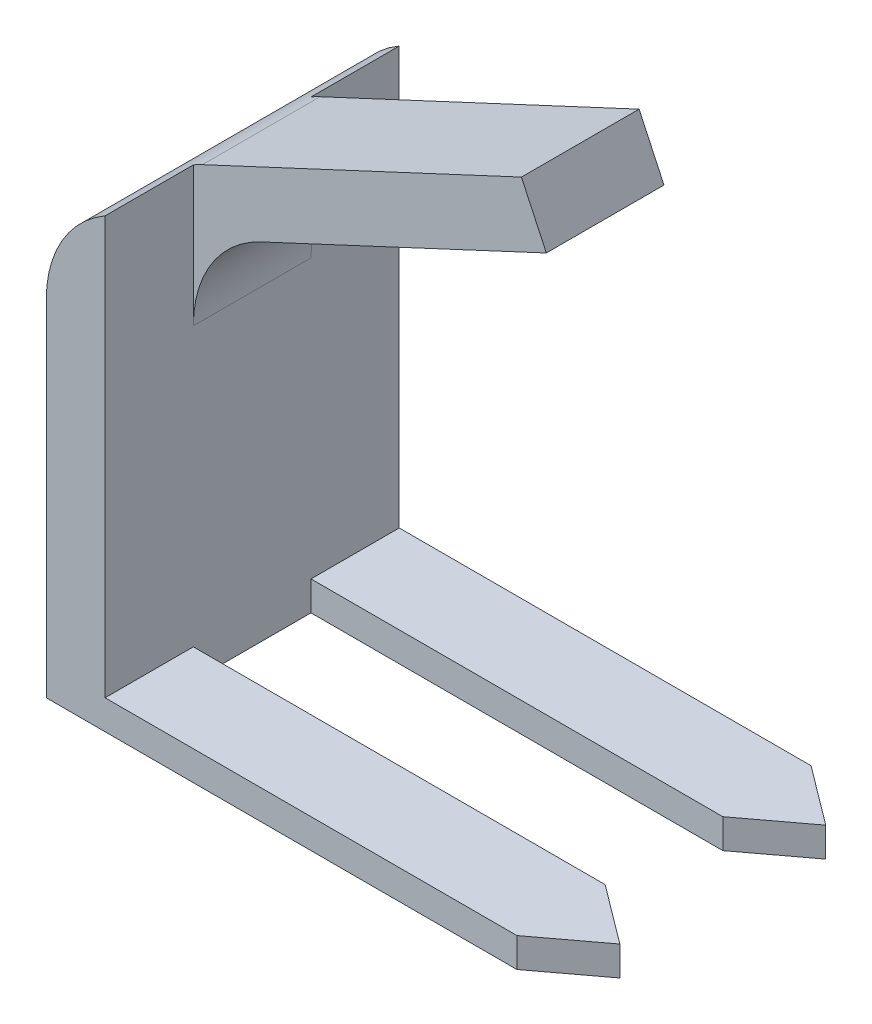
ISO-10303-21;
HEADER;
FILE_DESCRIPTION(('STEP AP214'),'2;1');
FILE_NAME('part.step','',(''),(''),'','','');
FILE_SCHEMA(('AUTOMOTIVE_DESIGN { 1 0 10303 214 1 1 1 1 }'));
ENDSEC;
DATA;
#1=APPLICATION_CONTEXT('core data for automotive mechanical design processes');
#2=APPLICATION_PROTOCOL_DEFINITION('international standard','automotive_design',2000,#1);
#3=PRODUCT_CONTEXT('',#1,'mechanical');
#4=PRODUCT('Part','Part','',(#3));
#5=PRODUCT_RELATED_PRODUCT_CATEGORY('part','',(#4));
#6=PRODUCT_DEFINITION_FORMATION('','',#4);
#7=PRODUCT_DEFINITION_CONTEXT('part definition',#1,'design');
#8=PRODUCT_DEFINITION('design','',#6,#7);
#9=PRODUCT_DEFINITION_SHAPE('','',#8);
#10=(LENGTH_UNIT() NAMED_UNIT(*) SI_UNIT(.MILLI.,.METRE.));
#11=(NAMED_UNIT(*) PLANE_ANGLE_UNIT() SI_UNIT($,.RADIAN.));
#12=(NAMED_UNIT(*) SI_UNIT($,.STERADIAN.) SOLID_ANGLE_UNIT());
#13=UNCERTAINTY_MEASURE_WITH_UNIT(LENGTH_MEASURE(1.E-05),#10,'distance_accuracy_value','');
#14=(GEOMETRIC_REPRESENTATION_CONTEXT(3) GLOBAL_UNCERTAINTY_ASSIGNED_CONTEXT((#13)) GLOBAL_UNIT_ASSIGNED_CONTEXT((#10,
#11,#12)) REPRESENTATION_CONTEXT('',''));
#15=CARTESIAN_POINT('',(0.,0.,0.));
#16=DIRECTION('',(0.,0.,1.));
#17=DIRECTION('',(1.,0.,0.));
#18=AXIS2_PLACEMENT_3D('',#15,#16,#17);
#19=CARTESIAN_POINT('',(-80.,65.,25.));
#20=DIRECTION('',(-0.422618261740701,0.906307787036649,0.));
#21=DIRECTION('',(-0.906307787036649,-0.422618261740701,0.));
#22=AXIS2_PLACEMENT_3D('',#19,#20,#21);
#23=PLANE('',#22);
#24=DIRECTION('',(-0.906307787036649,-0.422618261740701,0.));
#25=VECTOR('',#24,1.);
#26=CARTESIAN_POINT('',(-80.,65.,-10.));
#27=LINE('',#26,#25);
#28=CARTESIAN_POINT('',(-20.,92.9784594893,-10.));
#29=VERTEX_POINT('',#28);
#30=CARTESIAN_POINT('',(-68.452365234814,70.3847505245831,-10.));
#31=VERTEX_POINT('',#30);
#32=EDGE_CURVE('E175',#29,#31,#27,.T.);
#33=ORIENTED_EDGE('',*,*,#32,.F.);
#34=DIRECTION('',(0.,0.,-1.));
#35=VECTOR('',#34,1.);
#36=CARTESIAN_POINT('',(-20.,92.9784594893,25.));
#37=LINE('',#36,#35);
#38=CARTESIAN_POINT('',(-20.,92.9784594893,10.));
#39=VERTEX_POINT('',#38);
#40=EDGE_CURVE('E174',#39,#29,#37,.T.);
#41=ORIENTED_EDGE('',*,*,#40,.F.);
#42=DIRECTION('',(0.906307787036649,0.422618261740701,0.));
#43=VECTOR('',#42,1.);
#44=CARTESIAN_POINT('',(-80.,65.,10.));
#45=LINE('',#44,#43);
#46=CARTESIAN_POINT('',(-68.452365234814,70.3847505245831,10.));
#47=VERTEX_POINT('',#46);
#48=EDGE_CURVE('E238',#47,#39,#45,.T.);
#49=ORIENTED_EDGE('',*,*,#48,.F.);
#50=DIRECTION('',(0.,0.,-1.));
#51=VECTOR('',#50,1.);
#52=CARTESIAN_POINT('',(-68.452365234814,70.3847505245831,-25.));
#53=LINE('',#52,#51);
#54=EDGE_CURVE('E191',#47,#31,#53,.T.);
#55=ORIENTED_EDGE('',*,*,#54,.T.);
#56=EDGE_LOOP('',(#33,#41,#49,#55));
#57=FACE_BOUND('',#56,.T.);
#58=ADVANCED_FACE('F32',(#57),#23,.F.);
#59=CARTESIAN_POINT('',(-20.,92.9784594893,25.));
#60=DIRECTION('',(-0.906307787036649,-0.422618261740701,0.));
#61=DIRECTION('',(0.422618261740701,-0.906307787036649,0.));
#62=AXIS2_PLACEMENT_3D('',#59,#60,#61);
#63=PLANE('',#62);
#64=DIRECTION('',(0.422618261740701,-0.906307787036649,0.));
#65=VECTOR('',#64,1.);
#66=CARTESIAN_POINT('',(-20.,92.9784594893,-10.));
#67=LINE('',#66,#65);
#68=CARTESIAN_POINT('',(-24.226182617407,102.041537359667,-10.));
#69=VERTEX_POINT('',#68);
#70=EDGE_CURVE('E160',#69,#29,#67,.T.);
#71=ORIENTED_EDGE('',*,*,#70,.F.);
#72=DIRECTION('',(0.,0.,-1.));
#73=VECTOR('',#72,1.);
#74=CARTESIAN_POINT('',(-24.226182617407,102.041537359667,25.));
#75=LINE('',#74,#73);
#76=CARTESIAN_POINT('',(-24.226182617407,102.041537359667,10.));
#77=VERTEX_POINT('',#76);
#78=EDGE_CURVE('E172',#77,#69,#75,.T.);
#79=ORIENTED_EDGE('',*,*,#78,.F.);
#80=DIRECTION('',(-0.422618261740701,0.906307787036649,0.));
#81=VECTOR('',#80,1.);
#82=CARTESIAN_POINT('',(-20.,92.9784594893,10.));
#83=LINE('',#82,#81);
#84=EDGE_CURVE('E232',#39,#77,#83,.T.);
#85=ORIENTED_EDGE('',*,*,#84,.F.);
#86=ORIENTED_EDGE('',*,*,#40,.T.);
#87=EDGE_LOOP('',(#71,#79,#85,#86));
#88=FACE_BOUND('',#87,.T.);
#89=ADVANCED_FACE('F170',(#88),#63,.F.);
#90=CARTESIAN_POINT('',(-24.226182617407,102.041537359667,25.));
#91=DIRECTION('',(0.422618261740701,-0.906307787036649,0.));
#92=DIRECTION('',(0.906307787036649,0.422618261740701,0.));
#93=AXIS2_PLACEMENT_3D('',#90,#91,#92);
#94=PLANE('',#93);
#95=DIRECTION('',(0.906307787036649,0.422618261740701,0.));
#96=VECTOR('',#95,1.);
#97=CARTESIAN_POINT('',(-24.226182617407,102.041537359667,-10.));
#98=LINE('',#97,#96);
#99=CARTESIAN_POINT('',(-78.452365234814,76.755453132658,-10.));
#100=VERTEX_POINT('',#99);
#101=EDGE_CURVE('E157',#100,#69,#98,.T.);
#102=ORIENTED_EDGE('',*,*,#101,.F.);
#103=DIRECTION('',(0.,0.,-1.));
#104=VECTOR('',#103,1.);
#105=CARTESIAN_POINT('',(-78.452365234814,76.755453132658,25.));
#106=LINE('',#105,#104);
#107=CARTESIAN_POINT('',(-78.452365234814,76.755453132658,10.));
#108=VERTEX_POINT('',#107);
#109=EDGE_CURVE('E47',#100,#108,#106,.F.);
#110=ORIENTED_EDGE('',*,*,#109,.T.);
#111=DIRECTION('',(-0.906307787036649,-0.422618261740701,0.));
#112=VECTOR('',#111,1.);
#113=CARTESIAN_POINT('',(-24.226182617407,102.041537359667,10.));
#114=LINE('',#113,#112);
#115=EDGE_CURVE('E178',#77,#108,#114,.T.);
#116=ORIENTED_EDGE('',*,*,#115,.F.);
#117=ORIENTED_EDGE('',*,*,#78,.T.);
#118=EDGE_LOOP('',(#102,#110,#116,#117));
#119=FACE_BOUND('',#118,.T.);
#120=ADVANCED_FACE('F177',(#119),#94,.F.);
#121=CARTESIAN_POINT('',(-60.,52.2585947838502,25.));
#122=DIRECTION('',(0.,0.,1.));
#123=DIRECTION('',(1.,0.,0.));
#124=AXIS2_PLACEMENT_3D('',#121,#122,#123);
#125=CYLINDRICAL_SURFACE('',#124,20.);
#126=CARTESIAN_POINT('',(-60.,52.2585947838502,-10.));
#127=DIRECTION('',(0.,0.,-1.));
#128=DIRECTION('',(-1.,0.,0.));
#129=AXIS2_PLACEMENT_3D('',#126,#127,#128);
#130=CIRCLE('',#129,20.);
#131=CARTESIAN_POINT('',(-80.,52.2585947838502,-10.));
#132=VERTEX_POINT('',#131);
#133=EDGE_CURVE('E230',#31,#132,#130,.F.);
#134=ORIENTED_EDGE('',*,*,#133,.F.);
#135=ORIENTED_EDGE('',*,*,#54,.F.);
#136=CARTESIAN_POINT('',(-60.,52.2585947838502,10.));
#137=DIRECTION('',(0.,0.,1.));
#138=DIRECTION('',(1.,0.,0.));
#139=AXIS2_PLACEMENT_3D('',#136,#137,#138);
#140=CIRCLE('',#139,20.);
#141=CARTESIAN_POINT('',(-80.,52.2585947838502,10.));
#142=VERTEX_POINT('',#141);
#143=EDGE_CURVE('E240',#142,#47,#140,.F.);
#144=ORIENTED_EDGE('',*,*,#143,.F.);
#145=DIRECTION('',(0.,0.,-1.));
#146=VECTOR('',#145,1.);
#147=CARTESIAN_POINT('',(-80.,52.2585947838502,25.));
#148=LINE('',#147,#146);
#149=EDGE_CURVE('E194',#132,#142,#148,.F.);
#150=ORIENTED_EDGE('',*,*,#149,.F.);
#151=EDGE_LOOP('',(#134,#135,#144,#150));
#152=FACE_BOUND('',#151,.T.);
#153=ADVANCED_FACE('F355',(#152),#125,.F.);
#154=CARTESIAN_POINT('',(-70.,58.6292973919251,25.));
#155=DIRECTION('',(0.,0.,-1.));
#156=DIRECTION('',(-1.,0.,0.));
#157=AXIS2_PLACEMENT_3D('',#154,#155,#156);
#158=CYLINDRICAL_SURFACE('',#157,20.);
#159=CARTESIAN_POINT('',(-70.,58.6292973919251,-10.));
#160=DIRECTION('',(0.,0.,-1.));
#161=DIRECTION('',(-1.,0.,0.));
#162=AXIS2_PLACEMENT_3D('',#159,#160,#161);
#163=CIRCLE('',#162,20.);
#164=CARTESIAN_POINT('',(-80.,75.9498054676138,-10.));
#165=VERTEX_POINT('',#164);
#166=EDGE_CURVE('E164',#100,#165,#163,.F.);
#167=ORIENTED_EDGE('',*,*,#166,.T.);
#168=DIRECTION('',(0.,0.,-1.));
#169=VECTOR('',#168,1.);
#170=CARTESIAN_POINT('',(-80.,75.9498054676138,25.));
#171=LINE('',#170,#169);
#172=CARTESIAN_POINT('',(-80.,75.9498054676138,-25.));
#173=VERTEX_POINT('',#172);
#174=EDGE_CURVE('E346',#165,#173,#171,.T.);
#175=ORIENTED_EDGE('',*,*,#174,.T.);
#176=CARTESIAN_POINT('',(-70.,58.6292973919251,-25.));
#177=DIRECTION('',(0.,0.,-1.));
#178=DIRECTION('',(-1.,0.,0.));
#179=AXIS2_PLACEMENT_3D('',#176,#177,#178);
#180=CIRCLE('',#179,20.);
#181=CARTESIAN_POINT('',(-90.,58.6292973919251,-25.));
#182=VERTEX_POINT('',#181);
#183=EDGE_CURVE('E199',#182,#173,#180,.T.);
#184=ORIENTED_EDGE('',*,*,#183,.F.);
#185=DIRECTION('',(0.,0.,-1.));
#186=VECTOR('',#185,1.);
#187=CARTESIAN_POINT('',(-90.,58.6292973919251,25.));
#188=LINE('',#187,#186);
#189=CARTESIAN_POINT('',(-90.,58.6292973919251,25.));
#190=VERTEX_POINT('',#189);
#191=EDGE_CURVE('E196',#190,#182,#188,.T.);
#192=ORIENTED_EDGE('',*,*,#191,.F.);
#193=CARTESIAN_POINT('',(-70.,58.6292973919251,25.));
#194=DIRECTION('',(0.,0.,-1.));
#195=DIRECTION('',(-1.,0.,0.));
#196=AXIS2_PLACEMENT_3D('',#193,#194,#195);
#197=CIRCLE('',#196,20.);
#198=CARTESIAN_POINT('',(-80.,75.9498054676138,25.));
#199=VERTEX_POINT('',#198);
#200=EDGE_CURVE('E55',#199,#190,#197,.F.);
#201=ORIENTED_EDGE('',*,*,#200,.F.);
#202=DIRECTION('',(0.,0.,-1.));
#203=VECTOR('',#202,1.);
#204=CARTESIAN_POINT('',(-80.,75.9498054676138,25.));
#205=LINE('',#204,#203);
#206=CARTESIAN_POINT('',(-80.,75.9498054676138,10.));
#207=VERTEX_POINT('',#206);
#208=EDGE_CURVE('E11',#199,#207,#205,.T.);
#209=ORIENTED_EDGE('',*,*,#208,.T.);
#210=CARTESIAN_POINT('',(-70.,58.6292973919251,10.));
#211=DIRECTION('',(0.,0.,1.));
#212=DIRECTION('',(1.,0.,0.));
#213=AXIS2_PLACEMENT_3D('',#210,#211,#212);
#214=CIRCLE('',#213,20.);
#215=EDGE_CURVE('E40',#207,#108,#214,.F.);
#216=ORIENTED_EDGE('',*,*,#215,.T.);
#217=ORIENTED_EDGE('',*,*,#109,.F.);
#218=EDGE_LOOP('',(#167,#175,#184,#192,#201,#209,#216,#217));
#219=FACE_BOUND('',#218,.T.);
#220=ADVANCED_FACE('F34',(#219),#158,.T.);
#221=CARTESIAN_POINT('',(0.,0.,-25.));
#222=DIRECTION('',(0.,0.,-1.));
#223=DIRECTION('',(-1.,0.,0.));
#224=AXIS2_PLACEMENT_3D('',#221,#222,#223);
#225=PLANE('',#224);
#226=ORIENTED_EDGE('',*,*,#183,.T.);
#227=DIRECTION('',(0.,1.,0.));
#228=VECTOR('',#227,1.);
#229=CARTESIAN_POINT('',(-80.,65.,-25.));
#230=LINE('',#229,#228);
#231=CARTESIAN_POINT('',(-80.,5.,-25.));
#232=VERTEX_POINT('',#231);
#233=EDGE_CURVE('E294',#232,#173,#230,.T.);
#234=ORIENTED_EDGE('',*,*,#233,.F.);
#235=DIRECTION('',(-1.,0.,0.));
#236=VECTOR('',#235,1.);
#237=CARTESIAN_POINT('',(-80.,5.,-25.));
#238=LINE('',#237,#236);
#239=CARTESIAN_POINT('',(-9.99999999999998,5.,-25.));
#240=VERTEX_POINT('',#239);
#241=EDGE_CURVE('E283',#240,#232,#238,.T.);
#242=ORIENTED_EDGE('',*,*,#241,.F.);
#243=DIRECTION('',(0.,1.,0.));
#244=VECTOR('',#243,1.);
#245=CARTESIAN_POINT('',(-9.99999999999998,-5.,-25.));
#246=LINE('',#245,#244);
#247=CARTESIAN_POINT('',(-9.99999999999998,0.,-25.));
#248=VERTEX_POINT('',#247);
#249=EDGE_CURVE('E250',#248,#240,#246,.T.);
#250=ORIENTED_EDGE('',*,*,#249,.F.);
#251=DIRECTION('',(1.,0.,0.));
#252=VECTOR('',#251,1.);
#253=CARTESIAN_POINT('',(0.,0.,-25.));
#254=LINE('',#253,#252);
#255=CARTESIAN_POINT('',(-90.,0.,-25.));
#256=VERTEX_POINT('',#255);
#257=EDGE_CURVE('E287',#256,#248,#254,.T.);
#258=ORIENTED_EDGE('',*,*,#257,.F.);
#259=DIRECTION('',(0.,-1.,0.));
#260=VECTOR('',#259,1.);
#261=CARTESIAN_POINT('',(-90.,0.,-25.));
#262=LINE('',#261,#260);
#263=EDGE_CURVE('E296',#182,#256,#262,.T.);
#264=ORIENTED_EDGE('',*,*,#263,.F.);
#265=EDGE_LOOP('',(#226,#234,#242,#250,#258,#264));
#266=FACE_BOUND('',#265,.T.);
#267=ADVANCED_FACE('F308',(#266),#225,.T.);
#268=CARTESIAN_POINT('',(0.,0.,25.));
#269=DIRECTION('',(0.,0.,-1.));
#270=DIRECTION('',(-1.,0.,0.));
#271=AXIS2_PLACEMENT_3D('',#268,#269,#270);
#272=PLANE('',#271);
#273=DIRECTION('',(0.,1.,0.));
#274=VECTOR('',#273,1.);
#275=CARTESIAN_POINT('',(-80.,65.,25.));
#276=LINE('',#275,#274);
#277=CARTESIAN_POINT('',(-80.,5.,25.));
#278=VERTEX_POINT('',#277);
#279=EDGE_CURVE('E286',#278,#199,#276,.T.);
#280=ORIENTED_EDGE('',*,*,#279,.T.);
#281=ORIENTED_EDGE('',*,*,#200,.T.);
#282=DIRECTION('',(0.,-1.,0.));
#283=VECTOR('',#282,1.);
#284=CARTESIAN_POINT('',(-90.,0.,25.));
#285=LINE('',#284,#283);
#286=CARTESIAN_POINT('',(-90.,0.,25.));
#287=VERTEX_POINT('',#286);
#288=EDGE_CURVE('E289',#190,#287,#285,.T.);
#289=ORIENTED_EDGE('',*,*,#288,.T.);
#290=DIRECTION('',(1.,0.,0.));
#291=VECTOR('',#290,1.);
#292=CARTESIAN_POINT('',(0.,0.,25.));
#293=LINE('',#292,#291);
#294=CARTESIAN_POINT('',(-9.99999999999998,0.,25.));
#295=VERTEX_POINT('',#294);
#296=EDGE_CURVE('E184',#287,#295,#293,.T.);
#297=ORIENTED_EDGE('',*,*,#296,.T.);
#298=DIRECTION('',(0.,1.,0.));
#299=VECTOR('',#298,1.);
#300=CARTESIAN_POINT('',(-9.99999999999998,-5.,25.));
#301=LINE('',#300,#299);
#302=CARTESIAN_POINT('',(-9.99999999999998,5.,25.));
#303=VERTEX_POINT('',#302);
#304=EDGE_CURVE('E243',#295,#303,#301,.T.);
#305=ORIENTED_EDGE('',*,*,#304,.T.);
#306=DIRECTION('',(-1.,0.,0.));
#307=VECTOR('',#306,1.);
#308=CARTESIAN_POINT('',(-80.,5.,25.));
#309=LINE('',#308,#307);
#310=EDGE_CURVE('E284',#303,#278,#309,.T.);
#311=ORIENTED_EDGE('',*,*,#310,.T.);
#312=EDGE_LOOP('',(#280,#281,#289,#297,#305,#311));
#313=FACE_BOUND('',#312,.T.);
#314=ADVANCED_FACE('F341',(#313),#272,.F.);
#315=CARTESIAN_POINT('',(0.,0.,25.));
#316=DIRECTION('',(0.,1.,0.));
#317=DIRECTION('',(-1.,0.,0.));
#318=AXIS2_PLACEMENT_3D('',#315,#316,#317);
#319=PLANE('',#318);
#320=DIRECTION('',(0.8,0.,-0.600000000000001));
#321=VECTOR('',#320,1.);
#322=CARTESIAN_POINT('',(-3.6,0.,20.2));
#323=LINE('',#322,#321);
#324=CARTESIAN_POINT('',(0.,0.,17.5));
#325=VERTEX_POINT('',#324);
#326=EDGE_CURVE('E246',#295,#325,#323,.T.);
#327=ORIENTED_EDGE('',*,*,#326,.F.);
#328=ORIENTED_EDGE('',*,*,#296,.F.);
#329=DIRECTION('',(0.,0.,-1.));
#330=VECTOR('',#329,1.);
#331=CARTESIAN_POINT('',(-90.,0.,25.));
#332=LINE('',#331,#330);
#333=EDGE_CURVE('E179',#287,#256,#332,.T.);
#334=ORIENTED_EDGE('',*,*,#333,.T.);
#335=ORIENTED_EDGE('',*,*,#257,.T.);
#336=DIRECTION('',(0.8,0.,0.600000000000001));
#337=VECTOR('',#336,1.);
#338=CARTESIAN_POINT('',(20.4,0.,-2.19999999999997));
#339=LINE('',#338,#337);
#340=CARTESIAN_POINT('',(0.,0.,-17.5));
#341=VERTEX_POINT('',#340);
#342=EDGE_CURVE('E254',#248,#341,#339,.T.);
#343=ORIENTED_EDGE('',*,*,#342,.T.);
#344=DIRECTION('',(0.8,0.,-0.600000000000001));
#345=VECTOR('',#344,1.);
#346=CARTESIAN_POINT('',(-20.4,0.,-2.19999999999996));
#347=LINE('',#346,#345);
#348=CARTESIAN_POINT('',(-9.99999999999998,0.,-10.));
#349=VERTEX_POINT('',#348);
#350=EDGE_CURVE('E280',#349,#341,#347,.T.);
#351=ORIENTED_EDGE('',*,*,#350,.F.);
#352=DIRECTION('',(-1.,0.,0.));
#353=VECTOR('',#352,1.);
#354=CARTESIAN_POINT('',(0.,0.,-10.));
#355=LINE('',#354,#353);
#356=CARTESIAN_POINT('',(-80.,0.,-10.));
#357=VERTEX_POINT('',#356);
#358=EDGE_CURVE('E209',#349,#357,#355,.T.);
#359=ORIENTED_EDGE('',*,*,#358,.T.);
#360=DIRECTION('',(0.,0.,1.));
#361=VECTOR('',#360,1.);
#362=CARTESIAN_POINT('',(-80.,0.,25.));
#363=LINE('',#362,#361);
#364=CARTESIAN_POINT('',(-80.,0.,10.));
#365=VERTEX_POINT('',#364);
#366=EDGE_CURVE('E212',#357,#365,#363,.T.);
#367=ORIENTED_EDGE('',*,*,#366,.T.);
#368=DIRECTION('',(-1.,0.,0.));
#369=VECTOR('',#368,1.);
#370=CARTESIAN_POINT('',(0.,0.,10.));
#371=LINE('',#370,#369);
#372=CARTESIAN_POINT('',(-9.99999999999997,0.,10.));
#373=VERTEX_POINT('',#372);
#374=EDGE_CURVE('E215',#373,#365,#371,.T.);
#375=ORIENTED_EDGE('',*,*,#374,.F.);
#376=DIRECTION('',(0.799999999999999,0.,0.600000000000001));
#377=VECTOR('',#376,1.);
#378=CARTESIAN_POINT('',(3.6,0.,20.2));
#379=LINE('',#378,#377);
#380=EDGE_CURVE('E272',#373,#325,#379,.T.);
#381=ORIENTED_EDGE('',*,*,#380,.T.);
#382=EDGE_LOOP('',(#327,#328,#334,#335,#343,#351,#359,#367,#375,#381));
#383=FACE_BOUND('',#382,.T.);
#384=ADVANCED_FACE('F301',(#383),#319,.F.);
#385=CARTESIAN_POINT('',(-80.,5.,25.));
#386=DIRECTION('',(0.,-1.,0.));
#387=DIRECTION('',(0.,0.,-1.));
#388=AXIS2_PLACEMENT_3D('',#385,#386,#387);
#389=PLANE('',#388);
#390=ORIENTED_EDGE('',*,*,#310,.F.);
#391=DIRECTION('',(0.799999999999999,0.,-0.600000000000001));
#392=VECTOR('',#391,1.);
#393=CARTESIAN_POINT('',(8.4,5.,11.2));
#394=LINE('',#393,#392);
#395=CARTESIAN_POINT('',(0.,5.,17.5));
#396=VERTEX_POINT('',#395);
#397=EDGE_CURVE('E242',#303,#396,#394,.T.);
#398=ORIENTED_EDGE('',*,*,#397,.T.);
#399=DIRECTION('',(0.799999999999999,0.,0.600000000000001));
#400=VECTOR('',#399,1.);
#401=CARTESIAN_POINT('',(-8.40000000000001,5.,11.2));
#402=LINE('',#401,#400);
#403=CARTESIAN_POINT('',(-9.99999999999997,5.,10.));
#404=VERTEX_POINT('',#403);
#405=EDGE_CURVE('E266',#404,#396,#402,.T.);
#406=ORIENTED_EDGE('',*,*,#405,.F.);
#407=DIRECTION('',(-1.,0.,0.));
#408=VECTOR('',#407,1.);
#409=CARTESIAN_POINT('',(0.,5.,10.));
#410=LINE('',#409,#408);
#411=CARTESIAN_POINT('',(-80.,5.,10.));
#412=VERTEX_POINT('',#411);
#413=EDGE_CURVE('E263',#404,#412,#410,.T.);
#414=ORIENTED_EDGE('',*,*,#413,.T.);
#415=DIRECTION('',(0.,0.,-1.));
#416=VECTOR('',#415,1.);
#417=CARTESIAN_POINT('',(-80.,5.,25.));
#418=LINE('',#417,#416);
#419=EDGE_CURVE('E188',#278,#412,#418,.T.);
#420=ORIENTED_EDGE('',*,*,#419,.F.);
#421=EDGE_LOOP('',(#390,#398,#406,#414,#420));
#422=FACE_BOUND('',#421,.T.);
#423=ADVANCED_FACE('F336',(#422),#389,.F.);
#424=DIRECTION('',(-1.,0.,0.));
#425=VECTOR('',#424,1.);
#426=CARTESIAN_POINT('',(0.,5.,-10.));
#427=LINE('',#426,#425);
#428=CARTESIAN_POINT('',(-9.99999999999998,5.,-10.));
#429=VERTEX_POINT('',#428);
#430=CARTESIAN_POINT('',(-80.,5.,-10.));
#431=VERTEX_POINT('',#430);
#432=EDGE_CURVE('E260',#429,#431,#427,.T.);
#433=ORIENTED_EDGE('',*,*,#432,.F.);
#434=DIRECTION('',(0.799999999999999,0.,-0.600000000000001));
#435=VECTOR('',#434,1.);
#436=CARTESIAN_POINT('',(-8.4,5.,-11.2));
#437=LINE('',#436,#435);
#438=CARTESIAN_POINT('',(0.,5.,-17.5));
#439=VERTEX_POINT('',#438);
#440=EDGE_CURVE('E257',#429,#439,#437,.T.);
#441=ORIENTED_EDGE('',*,*,#440,.T.);
#442=DIRECTION('',(0.799999999999999,0.,0.600000000000001));
#443=VECTOR('',#442,1.);
#444=CARTESIAN_POINT('',(8.40000000000001,5.,-11.2));
#445=LINE('',#444,#443);
#446=EDGE_CURVE('E252',#240,#439,#445,.T.);
#447=ORIENTED_EDGE('',*,*,#446,.F.);
#448=ORIENTED_EDGE('',*,*,#241,.T.);
#449=EDGE_CURVE('E181',#431,#232,#418,.T.);
#450=ORIENTED_EDGE('',*,*,#449,.F.);
#451=EDGE_LOOP('',(#433,#441,#447,#448,#450));
#452=FACE_BOUND('',#451,.T.);
#453=ADVANCED_FACE('F316',(#452),#389,.F.);
#454=CARTESIAN_POINT('',(-80.,65.,25.));
#455=DIRECTION('',(-1.,0.,0.));
#456=DIRECTION('',(0.,0.,1.));
#457=AXIS2_PLACEMENT_3D('',#454,#455,#456);
#458=PLANE('',#457);
#459=ORIENTED_EDGE('',*,*,#233,.T.);
#460=ORIENTED_EDGE('',*,*,#174,.F.);
#461=DIRECTION('',(0.,-1.,0.));
#462=VECTOR('',#461,1.);
#463=CARTESIAN_POINT('',(-80.,102.041537359667,-10.));
#464=LINE('',#463,#462);
#465=EDGE_CURVE('E347',#165,#132,#464,.T.);
#466=ORIENTED_EDGE('',*,*,#465,.T.);
#467=ORIENTED_EDGE('',*,*,#149,.T.);
#468=DIRECTION('',(0.,-1.,0.));
#469=VECTOR('',#468,1.);
#470=CARTESIAN_POINT('',(-80.,102.041537359667,10.));
#471=LINE('',#470,#469);
#472=EDGE_CURVE('E223',#207,#142,#471,.T.);
#473=ORIENTED_EDGE('',*,*,#472,.F.);
#474=ORIENTED_EDGE('',*,*,#208,.F.);
#475=ORIENTED_EDGE('',*,*,#279,.F.);
#476=ORIENTED_EDGE('',*,*,#419,.T.);
#477=DIRECTION('',(0.,1.,0.));
#478=VECTOR('',#477,1.);
#479=CARTESIAN_POINT('',(-80.,-5.,10.));
#480=LINE('',#479,#478);
#481=EDGE_CURVE('E273',#365,#412,#480,.T.);
#482=ORIENTED_EDGE('',*,*,#481,.F.);
#483=ORIENTED_EDGE('',*,*,#366,.F.);
#484=DIRECTION('',(0.,1.,0.));
#485=VECTOR('',#484,1.);
#486=CARTESIAN_POINT('',(-80.,-5.,-10.));
#487=LINE('',#486,#485);
#488=EDGE_CURVE('E275',#357,#431,#487,.T.);
#489=ORIENTED_EDGE('',*,*,#488,.T.);
#490=ORIENTED_EDGE('',*,*,#449,.T.);
#491=EDGE_LOOP('',(#459,#460,#466,#467,#473,#474,#475,#476,#482,#483,#489,#490));
#492=FACE_BOUND('',#491,.T.);
#493=ADVANCED_FACE('F226',(#492),#458,.F.);
#494=CARTESIAN_POINT('',(-90.,0.,25.));
#495=DIRECTION('',(1.,0.,0.));
#496=DIRECTION('',(0.,0.,-1.));
#497=AXIS2_PLACEMENT_3D('',#494,#495,#496);
#498=PLANE('',#497);
#499=ORIENTED_EDGE('',*,*,#288,.F.);
#500=ORIENTED_EDGE('',*,*,#191,.T.);
#501=ORIENTED_EDGE('',*,*,#263,.T.);
#502=ORIENTED_EDGE('',*,*,#333,.F.);
#503=EDGE_LOOP('',(#499,#500,#501,#502));
#504=FACE_BOUND('',#503,.T.);
#505=ADVANCED_FACE('F344',(#504),#498,.F.);
#506=CARTESIAN_POINT('',(0.,-5.,10.));
#507=DIRECTION('',(0.,0.,-1.));
#508=DIRECTION('',(-1.,0.,0.));
#509=AXIS2_PLACEMENT_3D('',#506,#507,#508);
#510=PLANE('',#509);
#511=ORIENTED_EDGE('',*,*,#374,.T.);
#512=ORIENTED_EDGE('',*,*,#481,.T.);
#513=ORIENTED_EDGE('',*,*,#413,.F.);
#514=DIRECTION('',(0.,1.,0.));
#515=VECTOR('',#514,1.);
#516=CARTESIAN_POINT('',(-9.99999999999997,-5.,10.));
#517=LINE('',#516,#515);
#518=EDGE_CURVE('E270',#373,#404,#517,.T.);
#519=ORIENTED_EDGE('',*,*,#518,.F.);
#520=EDGE_LOOP('',(#511,#512,#513,#519));
#521=FACE_BOUND('',#520,.T.);
#522=ADVANCED_FACE('F331',(#521),#510,.T.);
#523=CARTESIAN_POINT('',(0.,-5.,-10.));
#524=DIRECTION('',(0.,0.,-1.));
#525=DIRECTION('',(-1.,0.,0.));
#526=AXIS2_PLACEMENT_3D('',#523,#524,#525);
#527=PLANE('',#526);
#528=DIRECTION('',(0.,1.,0.));
#529=VECTOR('',#528,1.);
#530=CARTESIAN_POINT('',(-9.99999999999998,-5.,-10.));
#531=LINE('',#530,#529);
#532=EDGE_CURVE('E269',#349,#429,#531,.T.);
#533=ORIENTED_EDGE('',*,*,#532,.T.);
#534=ORIENTED_EDGE('',*,*,#432,.T.);
#535=ORIENTED_EDGE('',*,*,#488,.F.);
#536=ORIENTED_EDGE('',*,*,#358,.F.);
#537=EDGE_LOOP('',(#533,#534,#535,#536));
#538=FACE_BOUND('',#537,.T.);
#539=ADVANCED_FACE('F326',(#538),#527,.F.);
#540=CARTESIAN_POINT('',(-8.4,-5.,-11.2));
#541=DIRECTION('',(0.600000000000001,0.,0.799999999999999));
#542=DIRECTION('',(0.799999999999999,0.,-0.600000000000001));
#543=AXIS2_PLACEMENT_3D('',#540,#541,#542);
#544=PLANE('',#543);
#545=ORIENTED_EDGE('',*,*,#350,.T.);
#546=DIRECTION('',(0.,1.,0.));
#547=VECTOR('',#546,1.);
#548=CARTESIAN_POINT('',(0.,5.,-17.5));
#549=LINE('',#548,#547);
#550=EDGE_CURVE('E206',#341,#439,#549,.T.);
#551=ORIENTED_EDGE('',*,*,#550,.T.);
#552=ORIENTED_EDGE('',*,*,#440,.F.);
#553=ORIENTED_EDGE('',*,*,#532,.F.);
#554=EDGE_LOOP('',(#545,#551,#552,#553));
#555=FACE_BOUND('',#554,.T.);
#556=ADVANCED_FACE('F322',(#555),#544,.T.);
#557=CARTESIAN_POINT('',(-8.40000000000001,-5.,11.2));
#558=DIRECTION('',(-0.600000000000001,0.,0.799999999999999));
#559=DIRECTION('',(0.799999999999999,0.,0.600000000000001));
#560=AXIS2_PLACEMENT_3D('',#557,#558,#559);
#561=PLANE('',#560);
#562=ORIENTED_EDGE('',*,*,#518,.T.);
#563=ORIENTED_EDGE('',*,*,#405,.T.);
#564=DIRECTION('',(0.,1.,0.));
#565=VECTOR('',#564,1.);
#566=CARTESIAN_POINT('',(0.,5.,17.5));
#567=LINE('',#566,#565);
#568=EDGE_CURVE('E204',#325,#396,#567,.T.);
#569=ORIENTED_EDGE('',*,*,#568,.F.);
#570=ORIENTED_EDGE('',*,*,#380,.F.);
#571=EDGE_LOOP('',(#562,#563,#569,#570));
#572=FACE_BOUND('',#571,.T.);
#573=ADVANCED_FACE('F339',(#572),#561,.F.);
#574=CARTESIAN_POINT('',(8.40000000000001,-5.,-11.2));
#575=DIRECTION('',(-0.600000000000001,0.,0.799999999999999));
#576=DIRECTION('',(0.799999999999999,0.,0.600000000000001));
#577=AXIS2_PLACEMENT_3D('',#574,#575,#576);
#578=PLANE('',#577);
#579=ORIENTED_EDGE('',*,*,#249,.T.);
#580=ORIENTED_EDGE('',*,*,#446,.T.);
#581=ORIENTED_EDGE('',*,*,#550,.F.);
#582=ORIENTED_EDGE('',*,*,#342,.F.);
#583=EDGE_LOOP('',(#579,#580,#581,#582));
#584=FACE_BOUND('',#583,.T.);
#585=ADVANCED_FACE('F313',(#584),#578,.F.);
#586=CARTESIAN_POINT('',(8.4,-5.,11.2));
#587=DIRECTION('',(0.600000000000001,0.,0.799999999999999));
#588=DIRECTION('',(0.799999999999999,0.,-0.600000000000001));
#589=AXIS2_PLACEMENT_3D('',#586,#587,#588);
#590=PLANE('',#589);
#591=ORIENTED_EDGE('',*,*,#326,.T.);
#592=ORIENTED_EDGE('',*,*,#568,.T.);
#593=ORIENTED_EDGE('',*,*,#397,.F.);
#594=ORIENTED_EDGE('',*,*,#304,.F.);
#595=EDGE_LOOP('',(#591,#592,#593,#594));
#596=FACE_BOUND('',#595,.T.);
#597=ADVANCED_FACE('F394',(#596),#590,.T.);
#598=CARTESIAN_POINT('',(-80.,102.041537359667,10.));
#599=DIRECTION('',(0.,0.,1.));
#600=DIRECTION('',(1.,0.,0.));
#601=AXIS2_PLACEMENT_3D('',#598,#599,#600);
#602=PLANE('',#601);
#603=ORIENTED_EDGE('',*,*,#143,.T.);
#604=ORIENTED_EDGE('',*,*,#48,.T.);
#605=ORIENTED_EDGE('',*,*,#84,.T.);
#606=ORIENTED_EDGE('',*,*,#115,.T.);
#607=ORIENTED_EDGE('',*,*,#215,.F.);
#608=ORIENTED_EDGE('',*,*,#472,.T.);
#609=EDGE_LOOP('',(#603,#604,#605,#606,#607,#608));
#610=FACE_BOUND('',#609,.T.);
#611=ADVANCED_FACE('F222',(#610),#602,.T.);
#612=CARTESIAN_POINT('',(-80.,102.041537359667,-10.));
#613=DIRECTION('',(0.,0.,-1.));
#614=DIRECTION('',(-1.,0.,0.));
#615=AXIS2_PLACEMENT_3D('',#612,#613,#614);
#616=PLANE('',#615);
#617=ORIENTED_EDGE('',*,*,#133,.T.);
#618=ORIENTED_EDGE('',*,*,#465,.F.);
#619=ORIENTED_EDGE('',*,*,#166,.F.);
#620=ORIENTED_EDGE('',*,*,#101,.T.);
#621=ORIENTED_EDGE('',*,*,#70,.T.);
#622=ORIENTED_EDGE('',*,*,#32,.T.);
#623=EDGE_LOOP('',(#617,#618,#619,#620,#621,#622));
#624=FACE_BOUND('',#623,.T.);
#625=ADVANCED_FACE('F159',(#624),#616,.T.);
#626=CLOSED_SHELL('',(#58,#89,#120,#153,#220,#267,#314,#384,#423,#453,#493,#505,#522,#539,#556,
#573,#585,#597,#611,#625));
#627=MANIFOLD_SOLID_BREP('B2',#626);
#628=ADVANCED_BREP_SHAPE_REPRESENTATION('',(#18,#627),#14);
#629=SHAPE_DEFINITION_REPRESENTATION(#9,#628);
ENDSEC;
END-ISO-10303-21;
